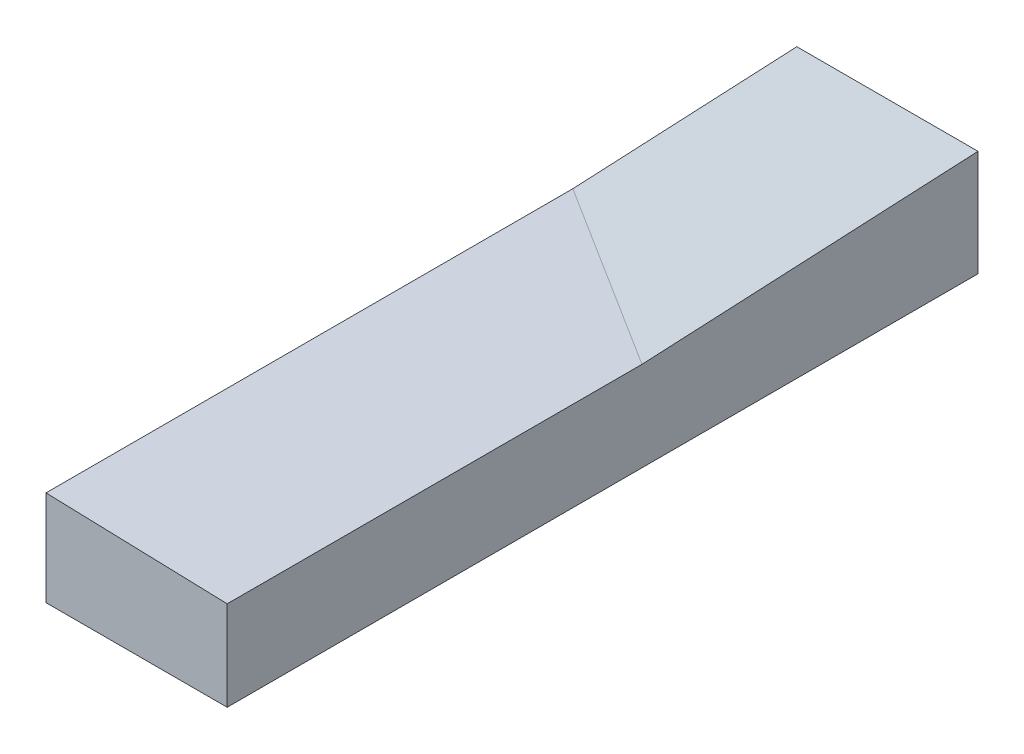
ISO-10303-21;
HEADER;
FILE_DESCRIPTION(('STEP AP214'),'2;1');
FILE_NAME('part.step','',(''),(''),'','','');
FILE_SCHEMA(('AUTOMOTIVE_DESIGN { 1 0 10303 214 1 1 1 1 }'));
ENDSEC;
DATA;
#1=APPLICATION_CONTEXT('core data for automotive mechanical design processes');
#2=APPLICATION_PROTOCOL_DEFINITION('international standard','automotive_design',2000,#1);
#3=PRODUCT_CONTEXT('',#1,'mechanical');
#4=PRODUCT('Part','Part','',(#3));
#5=PRODUCT_RELATED_PRODUCT_CATEGORY('part','',(#4));
#6=PRODUCT_DEFINITION_FORMATION('','',#4);
#7=PRODUCT_DEFINITION_CONTEXT('part definition',#1,'design');
#8=PRODUCT_DEFINITION('design','',#6,#7);
#9=PRODUCT_DEFINITION_SHAPE('','',#8);
#10=(LENGTH_UNIT() NAMED_UNIT(*) SI_UNIT(.MILLI.,.METRE.));
#11=(NAMED_UNIT(*) PLANE_ANGLE_UNIT() SI_UNIT($,.RADIAN.));
#12=(NAMED_UNIT(*) SI_UNIT($,.STERADIAN.) SOLID_ANGLE_UNIT());
#13=UNCERTAINTY_MEASURE_WITH_UNIT(LENGTH_MEASURE(1.E-05),#10,'distance_accuracy_value','');
#14=(GEOMETRIC_REPRESENTATION_CONTEXT(3) GLOBAL_UNCERTAINTY_ASSIGNED_CONTEXT((#13)) GLOBAL_UNIT_ASSIGNED_CONTEXT((#10,
#11,#12)) REPRESENTATION_CONTEXT('',''));
#15=CARTESIAN_POINT('',(0.,0.,0.));
#16=DIRECTION('',(0.,0.,1.));
#17=DIRECTION('',(1.,0.,0.));
#18=AXIS2_PLACEMENT_3D('',#15,#16,#17);
#19=CARTESIAN_POINT('',(3.80999999999998,0.,0.));
#20=DIRECTION('',(-1.,0.,0.));
#21=DIRECTION('',(0.,0.,1.));
#22=AXIS2_PLACEMENT_3D('',#19,#20,#21);
#23=PLANE('',#22);
#24=DIRECTION('',(0.,0.,1.));
#25=VECTOR('',#24,1.);
#26=CARTESIAN_POINT('',(3.80999999999998,69.7345454545455,-584.2));
#27=LINE('',#26,#25);
#28=CARTESIAN_POINT('',(3.80999999999995,69.7345454545455,-322.764727272727));
#29=VERTEX_POINT('',#28);
#30=CARTESIAN_POINT('',(3.80999999999998,69.7345454545455,0.));
#31=VERTEX_POINT('',#30);
#32=EDGE_CURVE('E45',#29,#31,#27,.T.);
#33=ORIENTED_EDGE('',*,*,#32,.T.);
#34=DIRECTION('',(0.,1.,0.));
#35=VECTOR('',#34,1.);
#36=CARTESIAN_POINT('',(3.80999999999998,0.,0.));
#37=LINE('',#36,#35);
#38=CARTESIAN_POINT('',(3.80999999999998,0.,0.));
#39=VERTEX_POINT('',#38);
#40=EDGE_CURVE('E132',#39,#31,#37,.T.);
#41=ORIENTED_EDGE('',*,*,#40,.F.);
#42=DIRECTION('',(0.,0.,-1.));
#43=VECTOR('',#42,1.);
#44=CARTESIAN_POINT('',(3.80999999999998,0.,-584.2));
#45=LINE('',#44,#43);
#46=CARTESIAN_POINT('',(3.80999999999998,0.,-584.2));
#47=VERTEX_POINT('',#46);
#48=EDGE_CURVE('E51',#39,#47,#45,.T.);
#49=ORIENTED_EDGE('',*,*,#48,.T.);
#50=DIRECTION('',(0.,1.,0.));
#51=VECTOR('',#50,1.);
#52=CARTESIAN_POINT('',(3.80999999999998,0.,-584.2));
#53=LINE('',#52,#51);
#54=CARTESIAN_POINT('',(3.80999999999998,82.55,-584.2));
#55=VERTEX_POINT('',#54);
#56=EDGE_CURVE('E11',#47,#55,#53,.T.);
#57=ORIENTED_EDGE('',*,*,#56,.T.);
#58=DIRECTION('',(0.,-0.0489608186254638,0.998800699959469));
#59=VECTOR('',#58,1.);
#60=CARTESIAN_POINT('',(3.80999999999998,82.55,-584.2));
#61=LINE('',#60,#59);
#62=EDGE_CURVE('E65',#55,#29,#61,.T.);
#63=ORIENTED_EDGE('',*,*,#62,.T.);
#64=EDGE_LOOP('',(#33,#41,#49,#57,#63));
#65=FACE_BOUND('',#64,.T.);
#66=ADVANCED_FACE('F42',(#65),#23,.F.);
#67=CARTESIAN_POINT('',(-137.16,0.,0.));
#68=DIRECTION('',(-1.,0.,0.));
#69=DIRECTION('',(0.,0.,1.));
#70=AXIS2_PLACEMENT_3D('',#67,#68,#69);
#71=PLANE('',#70);
#72=DIRECTION('',(0.,-0.0489608186254638,0.998800699959469));
#73=VECTOR('',#72,1.);
#74=CARTESIAN_POINT('',(-137.16,82.55,-584.2));
#75=LINE('',#74,#73);
#76=CARTESIAN_POINT('',(-137.16,82.55,-584.2));
#77=VERTEX_POINT('',#76);
#78=CARTESIAN_POINT('',(-137.16,74.0063636363637,-409.909818181818));
#79=VERTEX_POINT('',#78);
#80=EDGE_CURVE('E111',#77,#79,#75,.T.);
#81=ORIENTED_EDGE('',*,*,#80,.F.);
#82=DIRECTION('',(0.,1.,0.));
#83=VECTOR('',#82,1.);
#84=CARTESIAN_POINT('',(-137.16,0.,-584.2));
#85=LINE('',#84,#83);
#86=CARTESIAN_POINT('',(-137.16,0.,-584.2));
#87=VERTEX_POINT('',#86);
#88=EDGE_CURVE('E109',#87,#77,#85,.T.);
#89=ORIENTED_EDGE('',*,*,#88,.F.);
#90=DIRECTION('',(0.,0.,-1.));
#91=VECTOR('',#90,1.);
#92=CARTESIAN_POINT('',(-137.16,0.,-584.2));
#93=LINE('',#92,#91);
#94=CARTESIAN_POINT('',(-137.16,0.,0.));
#95=VERTEX_POINT('',#94);
#96=EDGE_CURVE('E95',#95,#87,#93,.T.);
#97=ORIENTED_EDGE('',*,*,#96,.F.);
#98=DIRECTION('',(0.,1.,0.));
#99=VECTOR('',#98,1.);
#100=CARTESIAN_POINT('',(-137.16,0.,0.));
#101=LINE('',#100,#99);
#102=CARTESIAN_POINT('',(-137.16,74.0063636363637,0.));
#103=VERTEX_POINT('',#102);
#104=EDGE_CURVE('E108',#95,#103,#101,.T.);
#105=ORIENTED_EDGE('',*,*,#104,.T.);
#106=DIRECTION('',(0.,0.,1.));
#107=VECTOR('',#106,1.);
#108=CARTESIAN_POINT('',(-137.16,74.0063636363637,-584.2));
#109=LINE('',#108,#107);
#110=EDGE_CURVE('E117',#79,#103,#109,.T.);
#111=ORIENTED_EDGE('',*,*,#110,.F.);
#112=EDGE_LOOP('',(#81,#89,#97,#105,#111));
#113=FACE_BOUND('',#112,.T.);
#114=ADVANCED_FACE('F106',(#113),#71,.T.);
#115=CARTESIAN_POINT('',(-419.1,82.55,-584.2));
#116=DIRECTION('',(0.0302891266407689,0.999541179145381,0.));
#117=DIRECTION('',(-0.999541179145382,0.030289126640769,0.));
#118=AXIS2_PLACEMENT_3D('',#115,#116,#117);
#119=PLANE('',#118);
#120=ORIENTED_EDGE('',*,*,#32,.F.);
#121=DIRECTION('',(0.850312150745116,-0.025767034871064,0.525647511369709));
#122=VECTOR('',#121,1.);
#123=CARTESIAN_POINT('',(-419.1,82.55,-584.2));
#124=LINE('',#123,#122);
#125=EDGE_CURVE('E126',#79,#29,#124,.T.);
#126=ORIENTED_EDGE('',*,*,#125,.F.);
#127=ORIENTED_EDGE('',*,*,#110,.T.);
#128=DIRECTION('',(-0.999541179145381,0.030289126640769,0.));
#129=VECTOR('',#128,1.);
#130=CARTESIAN_POINT('',(-419.1,82.55,0.));
#131=LINE('',#130,#129);
#132=EDGE_CURVE('E101',#31,#103,#131,.T.);
#133=ORIENTED_EDGE('',*,*,#132,.F.);
#134=EDGE_LOOP('',(#120,#126,#127,#133));
#135=FACE_BOUND('',#134,.T.);
#136=ADVANCED_FACE('F144',(#135),#119,.T.);
#137=CARTESIAN_POINT('',(-943.794471192522,82.55,-584.2));
#138=DIRECTION('',(0.,0.998800699959469,0.0489608186254638));
#139=DIRECTION('',(0.,-0.0489608186254638,0.998800699959469));
#140=AXIS2_PLACEMENT_3D('',#137,#138,#139);
#141=PLANE('',#140);
#142=ORIENTED_EDGE('',*,*,#62,.F.);
#143=DIRECTION('',(1.,0.,0.));
#144=VECTOR('',#143,1.);
#145=CARTESIAN_POINT('',(-943.794471192522,82.55,-584.2));
#146=LINE('',#145,#144);
#147=EDGE_CURVE('E123',#77,#55,#146,.T.);
#148=ORIENTED_EDGE('',*,*,#147,.F.);
#149=ORIENTED_EDGE('',*,*,#80,.T.);
#150=ORIENTED_EDGE('',*,*,#125,.T.);
#151=EDGE_LOOP('',(#142,#148,#149,#150));
#152=FACE_BOUND('',#151,.T.);
#153=ADVANCED_FACE('F146',(#152),#141,.T.);
#154=CARTESIAN_POINT('',(-419.1,0.,-584.2));
#155=DIRECTION('',(0.,-1.,0.));
#156=DIRECTION('',(0.,0.,-1.));
#157=AXIS2_PLACEMENT_3D('',#154,#155,#156);
#158=PLANE('',#157);
#159=ORIENTED_EDGE('',*,*,#48,.F.);
#160=DIRECTION('',(1.,0.,0.));
#161=VECTOR('',#160,1.);
#162=CARTESIAN_POINT('',(-419.1,0.,0.));
#163=LINE('',#162,#161);
#164=EDGE_CURVE('E91',#95,#39,#163,.T.);
#165=ORIENTED_EDGE('',*,*,#164,.F.);
#166=ORIENTED_EDGE('',*,*,#96,.T.);
#167=DIRECTION('',(1.,0.,0.));
#168=VECTOR('',#167,1.);
#169=CARTESIAN_POINT('',(-419.1,0.,-584.2));
#170=LINE('',#169,#168);
#171=EDGE_CURVE('E100',#87,#47,#170,.T.);
#172=ORIENTED_EDGE('',*,*,#171,.T.);
#173=EDGE_LOOP('',(#159,#165,#166,#172));
#174=FACE_BOUND('',#173,.T.);
#175=ADVANCED_FACE('F93',(#174),#158,.T.);
#176=CARTESIAN_POINT('',(0.,0.,-584.2));
#177=DIRECTION('',(0.,0.,-1.));
#178=DIRECTION('',(-1.,0.,0.));
#179=AXIS2_PLACEMENT_3D('',#176,#177,#178);
#180=PLANE('',#179);
#181=ORIENTED_EDGE('',*,*,#56,.F.);
#182=ORIENTED_EDGE('',*,*,#171,.F.);
#183=ORIENTED_EDGE('',*,*,#88,.T.);
#184=ORIENTED_EDGE('',*,*,#147,.T.);
#185=EDGE_LOOP('',(#181,#182,#183,#184));
#186=FACE_BOUND('',#185,.T.);
#187=ADVANCED_FACE('F147',(#186),#180,.T.);
#188=CARTESIAN_POINT('',(0.,0.,0.));
#189=DIRECTION('',(0.,0.,-1.));
#190=DIRECTION('',(-1.,0.,0.));
#191=AXIS2_PLACEMENT_3D('',#188,#189,#190);
#192=PLANE('',#191);
#193=ORIENTED_EDGE('',*,*,#164,.T.);
#194=ORIENTED_EDGE('',*,*,#40,.T.);
#195=ORIENTED_EDGE('',*,*,#132,.T.);
#196=ORIENTED_EDGE('',*,*,#104,.F.);
#197=EDGE_LOOP('',(#193,#194,#195,#196));
#198=FACE_BOUND('',#197,.T.);
#199=ADVANCED_FACE('F113',(#198),#192,.F.);
#200=CLOSED_SHELL('',(#66,#114,#136,#153,#175,#187,#199));
#201=MANIFOLD_SOLID_BREP('B2',#200);
#202=ADVANCED_BREP_SHAPE_REPRESENTATION('',(#18,#201),#14);
#203=SHAPE_DEFINITION_REPRESENTATION(#9,#202);
ENDSEC;
END-ISO-10303-21;
